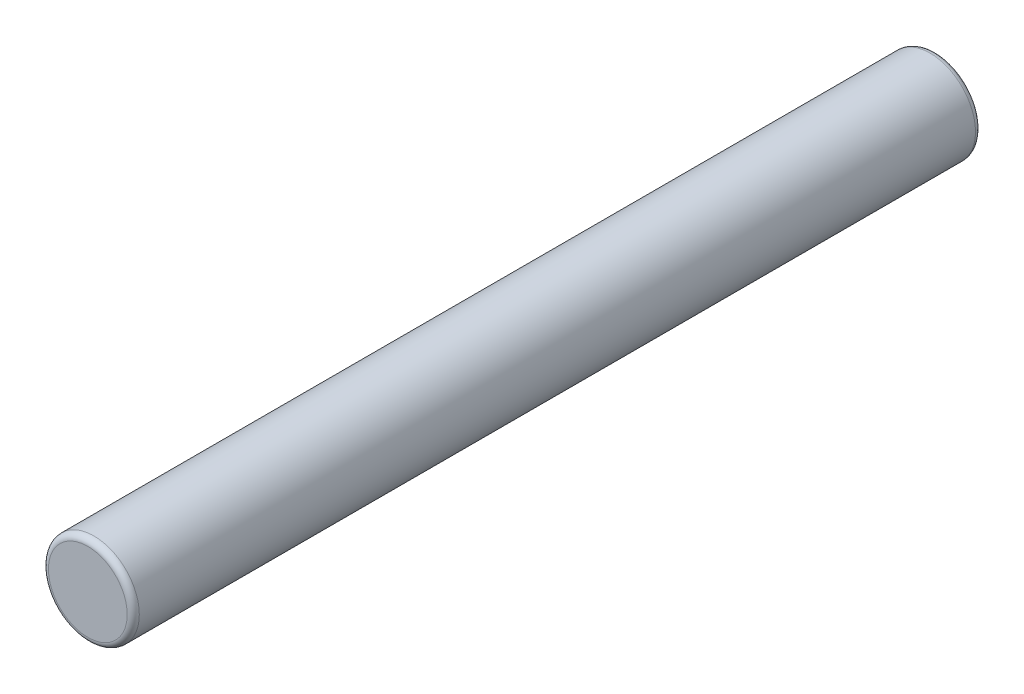
ISO-10303-21;
HEADER;
FILE_DESCRIPTION(('STEP AP214'),'2;1');
FILE_NAME('part.step','',(''),(''),'','','');
FILE_SCHEMA(('AUTOMOTIVE_DESIGN { 1 0 10303 214 1 1 1 1 }'));
ENDSEC;
DATA;
#1=APPLICATION_CONTEXT('core data for automotive mechanical design processes');
#2=APPLICATION_PROTOCOL_DEFINITION('international standard','automotive_design',2000,#1);
#3=PRODUCT_CONTEXT('',#1,'mechanical');
#4=PRODUCT('Part','Part','',(#3));
#5=PRODUCT_RELATED_PRODUCT_CATEGORY('part','',(#4));
#6=PRODUCT_DEFINITION_FORMATION('','',#4);
#7=PRODUCT_DEFINITION_CONTEXT('part definition',#1,'design');
#8=PRODUCT_DEFINITION('design','',#6,#7);
#9=PRODUCT_DEFINITION_SHAPE('','',#8);
#10=(LENGTH_UNIT() NAMED_UNIT(*) SI_UNIT(.MILLI.,.METRE.));
#11=(NAMED_UNIT(*) PLANE_ANGLE_UNIT() SI_UNIT($,.RADIAN.));
#12=(NAMED_UNIT(*) SI_UNIT($,.STERADIAN.) SOLID_ANGLE_UNIT());
#13=UNCERTAINTY_MEASURE_WITH_UNIT(LENGTH_MEASURE(1.E-05),#10,'distance_accuracy_value','');
#14=(GEOMETRIC_REPRESENTATION_CONTEXT(3) GLOBAL_UNCERTAINTY_ASSIGNED_CONTEXT((#13)) GLOBAL_UNIT_ASSIGNED_CONTEXT((#10,
#11,#12)) REPRESENTATION_CONTEXT('',''));
#15=CARTESIAN_POINT('',(0.,0.,0.));
#16=DIRECTION('',(0.,0.,1.));
#17=DIRECTION('',(1.,0.,0.));
#18=AXIS2_PLACEMENT_3D('',#15,#16,#17);
#19=CARTESIAN_POINT('',(0.,0.,14.));
#20=DIRECTION('',(0.,0.,-1.));
#21=DIRECTION('',(-1.,0.,0.));
#22=AXIS2_PLACEMENT_3D('',#19,#20,#21);
#23=CYLINDRICAL_SURFACE('',#22,0.75);
#24=CARTESIAN_POINT('',(0.,0.,13.9));
#25=DIRECTION('',(0.,0.,1.));
#26=DIRECTION('',(1.,0.,0.));
#27=AXIS2_PLACEMENT_3D('',#24,#25,#26);
#28=CIRCLE('',#27,0.75);
#29=CARTESIAN_POINT('',(0.75,0.,13.9));
#30=VERTEX_POINT('',#29);
#31=EDGE_CURVE('E31',#30,#30,#28,.F.);
#32=ORIENTED_EDGE('',*,*,#31,.T.);
#33=EDGE_LOOP('',(#32));
#34=FACE_BOUND('',#33,.T.);
#35=CARTESIAN_POINT('',(0.,0.,0.0999999999999994));
#36=DIRECTION('',(0.,0.,1.));
#37=DIRECTION('',(1.,0.,0.));
#38=AXIS2_PLACEMENT_3D('',#35,#36,#37);
#39=CIRCLE('',#38,0.75);
#40=CARTESIAN_POINT('',(0.75,0.,0.0999999999999994));
#41=VERTEX_POINT('',#40);
#42=EDGE_CURVE('E35',#41,#41,#39,.T.);
#43=ORIENTED_EDGE('',*,*,#42,.T.);
#44=EDGE_LOOP('',(#43));
#45=FACE_BOUND('',#44,.T.);
#46=ADVANCED_FACE('F25',(#34,#45),#23,.T.);
#47=CARTESIAN_POINT('',(0.,0.,14.));
#48=DIRECTION('',(0.,0.,1.));
#49=DIRECTION('',(1.,0.,0.));
#50=AXIS2_PLACEMENT_3D('',#47,#48,#49);
#51=PLANE('',#50);
#52=CARTESIAN_POINT('',(0.,0.,14.));
#53=DIRECTION('',(0.,0.,1.));
#54=DIRECTION('',(1.,0.,0.));
#55=AXIS2_PLACEMENT_3D('',#52,#53,#54);
#56=CIRCLE('',#55,0.65);
#57=CARTESIAN_POINT('',(0.65,0.,14.));
#58=VERTEX_POINT('',#57);
#59=EDGE_CURVE('E39',#58,#58,#56,.T.);
#60=ORIENTED_EDGE('',*,*,#59,.T.);
#61=EDGE_LOOP('',(#60));
#62=FACE_BOUND('',#61,.T.);
#63=ADVANCED_FACE('F45',(#62),#51,.T.);
#64=CARTESIAN_POINT('',(0.,0.,0.));
#65=DIRECTION('',(0.,0.,1.));
#66=DIRECTION('',(1.,0.,0.));
#67=AXIS2_PLACEMENT_3D('',#64,#65,#66);
#68=PLANE('',#67);
#69=CARTESIAN_POINT('',(0.,0.,0.));
#70=DIRECTION('',(0.,0.,1.));
#71=DIRECTION('',(1.,0.,0.));
#72=AXIS2_PLACEMENT_3D('',#69,#70,#71);
#73=CIRCLE('',#72,0.65);
#74=CARTESIAN_POINT('',(0.65,0.,0.));
#75=VERTEX_POINT('',#74);
#76=EDGE_CURVE('E10',#75,#75,#73,.F.);
#77=ORIENTED_EDGE('',*,*,#76,.T.);
#78=EDGE_LOOP('',(#77));
#79=FACE_BOUND('',#78,.T.);
#80=ADVANCED_FACE('F50',(#79),#68,.F.);
#81=CARTESIAN_POINT('',(0.,0.,13.9));
#82=DIRECTION('',(0.,0.,1.));
#83=DIRECTION('',(1.,0.,0.));
#84=AXIS2_PLACEMENT_3D('',#81,#82,#83);
#85=TOROIDAL_SURFACE('',#84,0.65,0.1);
#86=ORIENTED_EDGE('',*,*,#31,.F.);
#87=EDGE_LOOP('',(#86));
#88=FACE_BOUND('',#87,.T.);
#89=ORIENTED_EDGE('',*,*,#59,.F.);
#90=EDGE_LOOP('',(#89));
#91=FACE_BOUND('',#90,.T.);
#92=ADVANCED_FACE('F47',(#88,#91),#85,.T.);
#93=CARTESIAN_POINT('',(0.,0.,0.0999999999999994));
#94=DIRECTION('',(0.,0.,1.));
#95=DIRECTION('',(1.,0.,0.));
#96=AXIS2_PLACEMENT_3D('',#93,#94,#95);
#97=TOROIDAL_SURFACE('',#96,0.65,0.1);
#98=ORIENTED_EDGE('',*,*,#76,.F.);
#99=EDGE_LOOP('',(#98));
#100=FACE_BOUND('',#99,.T.);
#101=ORIENTED_EDGE('',*,*,#42,.F.);
#102=EDGE_LOOP('',(#101));
#103=FACE_BOUND('',#102,.T.);
#104=ADVANCED_FACE('F49',(#100,#103),#97,.T.);
#105=CLOSED_SHELL('',(#46,#63,#80,#92,#104));
#106=MANIFOLD_SOLID_BREP('B2',#105);
#107=ADVANCED_BREP_SHAPE_REPRESENTATION('',(#18,#106),#14);
#108=SHAPE_DEFINITION_REPRESENTATION(#9,#107);
ENDSEC;
END-ISO-10303-21;
